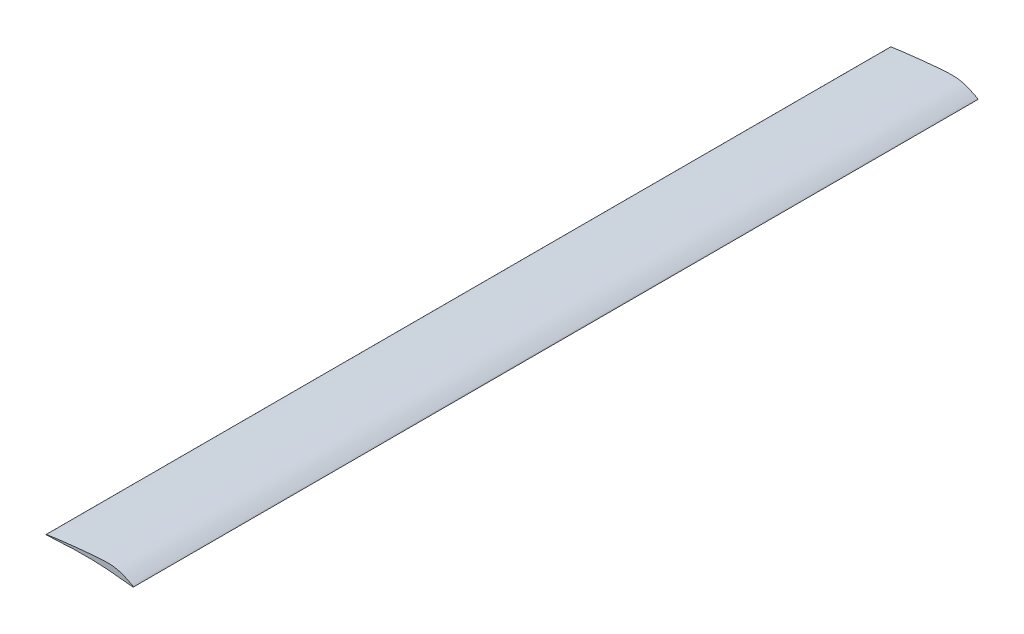
ISO-10303-21;
HEADER;
FILE_DESCRIPTION(('STEP AP214'),'2;1');
FILE_NAME('part.step','',(''),(''),'','','');
FILE_SCHEMA(('AUTOMOTIVE_DESIGN { 1 0 10303 214 1 1 1 1 }'));
ENDSEC;
DATA;
#1=APPLICATION_CONTEXT('core data for automotive mechanical design processes');
#2=APPLICATION_PROTOCOL_DEFINITION('international standard','automotive_design',2000,#1);
#3=PRODUCT_CONTEXT('',#1,'mechanical');
#4=PRODUCT('Part','Part','',(#3));
#5=PRODUCT_RELATED_PRODUCT_CATEGORY('part','',(#4));
#6=PRODUCT_DEFINITION_FORMATION('','',#4);
#7=PRODUCT_DEFINITION_CONTEXT('part definition',#1,'design');
#8=PRODUCT_DEFINITION('design','',#6,#7);
#9=PRODUCT_DEFINITION_SHAPE('','',#8);
#10=(LENGTH_UNIT() NAMED_UNIT(*) SI_UNIT(.MILLI.,.METRE.));
#11=(NAMED_UNIT(*) PLANE_ANGLE_UNIT() SI_UNIT($,.RADIAN.));
#12=(NAMED_UNIT(*) SI_UNIT($,.STERADIAN.) SOLID_ANGLE_UNIT());
#13=UNCERTAINTY_MEASURE_WITH_UNIT(LENGTH_MEASURE(1.E-05),#10,'distance_accuracy_value','');
#14=(GEOMETRIC_REPRESENTATION_CONTEXT(3) GLOBAL_UNCERTAINTY_ASSIGNED_CONTEXT((#13)) GLOBAL_UNIT_ASSIGNED_CONTEXT((#10,
#11,#12)) REPRESENTATION_CONTEXT('',''));
#15=CARTESIAN_POINT('',(0.,0.,0.));
#16=DIRECTION('',(0.,0.,1.));
#17=DIRECTION('',(1.,0.,0.));
#18=AXIS2_PLACEMENT_3D('',#15,#16,#17);
#19=CARTESIAN_POINT('',(0.,0.,24384.));
#20=CARTESIAN_POINT('',(-371.486611526441,198.954741641375,24384.));
#21=CARTESIAN_POINT('',(-874.499250656675,214.942042158271,24384.));
#22=CARTESIAN_POINT('',(-3054.94912902194,-49.7766104174255,24384.));
#23=CARTESIAN_POINT('',(-1650.63027929969,48.1252765541252,24384.));
#24=CARTESIAN_POINT('',(-894.233180364371,42.1772172765083,24384.));
#25=CARTESIAN_POINT('',(-485.552231982243,3.19602842635434,24384.));
#26=CARTESIAN_POINT('',(122.628786697464,-67.6168699909639,24384.));
#27=CARTESIAN_POINT('',(28.9898611048595,-15.5259170785113,24384.));
#28=CARTESIAN_POINT('',(0.,0.,24384.));
#29=B_SPLINE_CURVE_WITH_KNOTS('',3,(#19,#20,#21,#22,#23,#24,#25,#26,#27,#28),.UNSPECIFIED.,.T.,
.F.,(4,1,1,1,1,1,1,4),(0.,0.196796903673638,0.488014961801,0.611703159210797,0.788506569940794,
0.952091523996215,0.984642475054692,1.),.UNSPECIFIED.);
#30=DIRECTION('',(0.,0.,-1.));
#31=VECTOR('',#30,1.);
#32=SURFACE_OF_LINEAR_EXTRUSION('',#29,#31);
#33=CARTESIAN_POINT('',(0.,0.,24384.));
#34=VERTEX_POINT('',#33);
#35=EDGE_CURVE('E10',#34,#34,#29,.T.);
#36=ORIENTED_EDGE('',*,*,#35,.F.);
#37=EDGE_LOOP('',(#36));
#38=FACE_BOUND('',#37,.T.);
#39=CARTESIAN_POINT('',(0.,0.,0.));
#40=CARTESIAN_POINT('',(-371.486611526441,198.954741641375,0.));
#41=CARTESIAN_POINT('',(-874.499250656675,214.942042158271,0.));
#42=CARTESIAN_POINT('',(-3054.94912902194,-49.7766104174255,0.));
#43=CARTESIAN_POINT('',(-1650.63027929969,48.1252765541252,0.));
#44=CARTESIAN_POINT('',(-894.233180364371,42.1772172765083,0.));
#45=CARTESIAN_POINT('',(-485.552231982243,3.19602842635434,0.));
#46=CARTESIAN_POINT('',(122.628786697464,-67.6168699909639,0.));
#47=CARTESIAN_POINT('',(28.9898611048595,-15.5259170785113,0.));
#48=CARTESIAN_POINT('',(0.,0.,0.));
#49=B_SPLINE_CURVE_WITH_KNOTS('',3,(#39,#40,#41,#42,#43,#44,#45,#46,#47,#48),.UNSPECIFIED.,.T.,
.F.,(4,1,1,1,1,1,1,4),(0.,0.196796903673638,0.488014961801,0.611703159210797,0.788506569940794,
0.952091523996215,0.984642475054692,1.),.UNSPECIFIED.);
#50=CARTESIAN_POINT('',(0.,0.,0.));
#51=VERTEX_POINT('',#50);
#52=EDGE_CURVE('E34',#51,#51,#49,.T.);
#53=ORIENTED_EDGE('',*,*,#52,.T.);
#54=EDGE_LOOP('',(#53));
#55=FACE_BOUND('',#54,.T.);
#56=ADVANCED_FACE('F30',(#38,#55),#32,.F.);
#57=CARTESIAN_POINT('',(-2410.77926455957,0.129953508036566,24384.));
#58=DIRECTION('',(0.,0.,-1.));
#59=DIRECTION('',(-1.,0.,0.));
#60=AXIS2_PLACEMENT_3D('',#57,#58,#59);
#61=PLANE('',#60);
#62=ORIENTED_EDGE('',*,*,#35,.T.);
#63=EDGE_LOOP('',(#62));
#64=FACE_BOUND('',#63,.T.);
#65=ADVANCED_FACE('F53',(#64),#61,.F.);
#66=CARTESIAN_POINT('',(-2410.77926455957,0.129953508036566,0.));
#67=DIRECTION('',(0.,0.,-1.));
#68=DIRECTION('',(-1.,0.,0.));
#69=AXIS2_PLACEMENT_3D('',#66,#67,#68);
#70=PLANE('',#69);
#71=ORIENTED_EDGE('',*,*,#52,.F.);
#72=EDGE_LOOP('',(#71));
#73=FACE_BOUND('',#72,.T.);
#74=ADVANCED_FACE('F51',(#73),#70,.T.);
#75=CLOSED_SHELL('',(#56,#65,#74));
#76=MANIFOLD_SOLID_BREP('B2',#75);
#77=ADVANCED_BREP_SHAPE_REPRESENTATION('',(#18,#76),#14);
#78=SHAPE_DEFINITION_REPRESENTATION(#9,#77);
ENDSEC;
END-ISO-10303-21;
